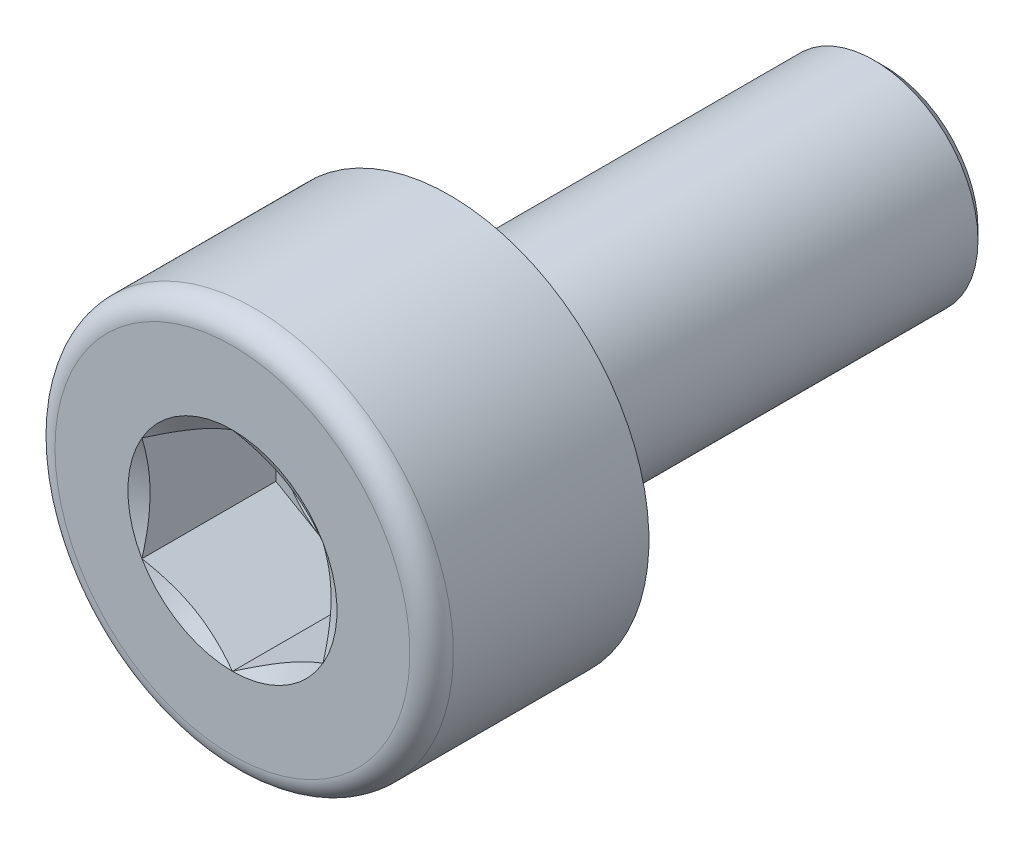
ISO-10303-21;
HEADER;
FILE_DESCRIPTION(('STEP AP214'),'2;1');
FILE_NAME('part.step','',(''),(''),'','','');
FILE_SCHEMA(('AUTOMOTIVE_DESIGN { 1 0 10303 214 1 1 1 1 }'));
ENDSEC;
DATA;
#1=APPLICATION_CONTEXT('core data for automotive mechanical design processes');
#2=APPLICATION_PROTOCOL_DEFINITION('international standard','automotive_design',2000,#1);
#3=PRODUCT_CONTEXT('',#1,'mechanical');
#4=PRODUCT('Part','Part','',(#3));
#5=PRODUCT_RELATED_PRODUCT_CATEGORY('part','',(#4));
#6=PRODUCT_DEFINITION_FORMATION('','',#4);
#7=PRODUCT_DEFINITION_CONTEXT('part definition',#1,'design');
#8=PRODUCT_DEFINITION('design','',#6,#7);
#9=PRODUCT_DEFINITION_SHAPE('','',#8);
#10=(LENGTH_UNIT() NAMED_UNIT(*) SI_UNIT(.MILLI.,.METRE.));
#11=(NAMED_UNIT(*) PLANE_ANGLE_UNIT() SI_UNIT($,.RADIAN.));
#12=(NAMED_UNIT(*) SI_UNIT($,.STERADIAN.) SOLID_ANGLE_UNIT());
#13=UNCERTAINTY_MEASURE_WITH_UNIT(LENGTH_MEASURE(1.E-05),#10,'distance_accuracy_value','');
#14=(GEOMETRIC_REPRESENTATION_CONTEXT(3) GLOBAL_UNCERTAINTY_ASSIGNED_CONTEXT((#13)) GLOBAL_UNIT_ASSIGNED_CONTEXT((#10,
#11,#12)) REPRESENTATION_CONTEXT('',''));
#15=CARTESIAN_POINT('',(0.,0.,0.));
#16=DIRECTION('',(0.,0.,1.));
#17=DIRECTION('',(1.,0.,0.));
#18=AXIS2_PLACEMENT_3D('',#15,#16,#17);
#19=CARTESIAN_POINT('',(0.,0.,-6.));
#20=DIRECTION('',(0.,0.,1.));
#21=DIRECTION('',(1.,0.,0.));
#22=AXIS2_PLACEMENT_3D('',#19,#20,#21);
#23=CONICAL_SURFACE('',#22,1.2933,0.7853981625);
#24=CARTESIAN_POINT('',(0.,0.,-6.));
#25=DIRECTION('',(0.,0.,-1.));
#26=DIRECTION('',(1.,0.,0.));
#27=AXIS2_PLACEMENT_3D('',#24,#25,#26);
#28=CIRCLE('',#27,1.2933);
#29=CARTESIAN_POINT('',(1.2933,0.,-6.));
#30=VERTEX_POINT('',#29);
#31=EDGE_CURVE('E381',#30,#30,#28,.T.);
#32=ORIENTED_EDGE('',*,*,#31,.F.);
#33=EDGE_LOOP('',(#32));
#34=FACE_BOUND('',#33,.T.);
#35=CARTESIAN_POINT('',(0.,0.,-5.8563));
#36=DIRECTION('',(0.,0.,1.));
#37=DIRECTION('',(1.,0.,0.));
#38=AXIS2_PLACEMENT_3D('',#35,#36,#37);
#39=CIRCLE('',#38,1.437);
#40=CARTESIAN_POINT('',(1.437,0.,-5.8563));
#41=VERTEX_POINT('',#40);
#42=EDGE_CURVE('E392',#41,#41,#39,.T.);
#43=ORIENTED_EDGE('',*,*,#42,.F.);
#44=EDGE_LOOP('',(#43));
#45=FACE_BOUND('',#44,.T.);
#46=ADVANCED_FACE('F16',(#34,#45),#23,.T.);
#47=CARTESIAN_POINT('',(0.,0.,-0.100000000000002));
#48=DIRECTION('',(0.,0.,1.));
#49=DIRECTION('',(1.,0.,0.));
#50=AXIS2_PLACEMENT_3D('',#47,#48,#49);
#51=TOROIDAL_SURFACE('',#50,1.537,0.1);
#52=CARTESIAN_POINT('',(0.,0.,-0.100000000000002));
#53=DIRECTION('',(0.,0.,-1.));
#54=DIRECTION('',(1.,0.,0.));
#55=AXIS2_PLACEMENT_3D('',#52,#53,#54);
#56=CIRCLE('',#55,1.437);
#57=CARTESIAN_POINT('',(1.437,0.,-0.100000000000002));
#58=VERTEX_POINT('',#57);
#59=EDGE_CURVE('E395',#58,#58,#56,.T.);
#60=ORIENTED_EDGE('',*,*,#59,.F.);
#61=EDGE_LOOP('',(#60));
#62=FACE_BOUND('',#61,.T.);
#63=CARTESIAN_POINT('',(0.,0.,0.));
#64=DIRECTION('',(0.,0.,1.));
#65=DIRECTION('',(1.,0.,0.));
#66=AXIS2_PLACEMENT_3D('',#63,#64,#65);
#67=CIRCLE('',#66,1.537);
#68=CARTESIAN_POINT('',(1.537,0.,0.));
#69=VERTEX_POINT('',#68);
#70=EDGE_CURVE('E292',#69,#69,#67,.T.);
#71=ORIENTED_EDGE('',*,*,#70,.F.);
#72=EDGE_LOOP('',(#71));
#73=FACE_BOUND('',#72,.T.);
#74=ADVANCED_FACE('F18',(#62,#73),#51,.F.);
#75=CARTESIAN_POINT('',(0.,0.,2.7));
#76=DIRECTION('',(0.,0.,-1.));
#77=DIRECTION('',(-1.,0.,0.));
#78=AXIS2_PLACEMENT_3D('',#75,#76,#77);
#79=TOROIDAL_SURFACE('',#78,2.45,0.3);
#80=CARTESIAN_POINT('',(0.,0.,2.7));
#81=DIRECTION('',(0.,0.,-1.));
#82=DIRECTION('',(-1.,0.,0.));
#83=AXIS2_PLACEMENT_3D('',#80,#81,#82);
#84=CIRCLE('',#83,2.75);
#85=CARTESIAN_POINT('',(-2.75,0.,2.7));
#86=VERTEX_POINT('',#85);
#87=EDGE_CURVE('E365',#86,#86,#84,.T.);
#88=ORIENTED_EDGE('',*,*,#87,.F.);
#89=EDGE_LOOP('',(#88));
#90=FACE_BOUND('',#89,.T.);
#91=CARTESIAN_POINT('',(0.,0.,3.));
#92=DIRECTION('',(0.,0.,1.));
#93=DIRECTION('',(-1.,0.,0.));
#94=AXIS2_PLACEMENT_3D('',#91,#92,#93);
#95=CIRCLE('',#94,2.45);
#96=CARTESIAN_POINT('',(-2.45,0.,3.));
#97=VERTEX_POINT('',#96);
#98=EDGE_CURVE('E367',#97,#97,#95,.T.);
#99=ORIENTED_EDGE('',*,*,#98,.F.);
#100=EDGE_LOOP('',(#99));
#101=FACE_BOUND('',#100,.T.);
#102=ADVANCED_FACE('F349',(#90,#101),#79,.T.);
#103=CARTESIAN_POINT('',(0.,0.,1.42831216351296));
#104=DIRECTION('',(0.,0.,1.));
#105=DIRECTION('',(1.,0.,0.));
#106=AXIS2_PLACEMENT_3D('',#103,#104,#105);
#107=CONICAL_SURFACE('',#106,1.73205080278248,1.04719755);
#108=CARTESIAN_POINT('',(0.,0.,0.428312163512963));
#109=VERTEX_POINT('',#108);
#110=VERTEX_LOOP('',#109);
#111=FACE_BOUND('',#110,.T.);
#112=CARTESIAN_POINT('',(0.,0.,1.15));
#113=DIRECTION('',(0.,0.,-1.));
#114=DIRECTION('',(-1.,0.,0.));
#115=AXIS2_PLACEMENT_3D('',#112,#113,#114);
#116=CIRCLE('',#115,1.25);
#117=CARTESIAN_POINT('',(-1.25,0.,1.15));
#118=VERTEX_POINT('',#117);
#119=CARTESIAN_POINT('',(-0.625,1.08253175473055,1.15));
#120=VERTEX_POINT('',#119);
#121=EDGE_CURVE('E154',#118,#120,#116,.T.);
#122=ORIENTED_EDGE('',*,*,#121,.F.);
#123=CARTESIAN_POINT('',(0.,0.,1.15));
#124=DIRECTION('',(0.,0.,1.));
#125=DIRECTION('',(1.,0.,0.));
#126=AXIS2_PLACEMENT_3D('',#123,#124,#125);
#127=CIRCLE('',#126,1.25);
#128=CARTESIAN_POINT('',(-0.625,-1.08253175473055,1.15));
#129=VERTEX_POINT('',#128);
#130=EDGE_CURVE('E427',#118,#129,#127,.T.);
#131=ORIENTED_EDGE('',*,*,#130,.T.);
#132=CARTESIAN_POINT('',(0.,0.,1.15));
#133=DIRECTION('',(0.,0.,1.));
#134=DIRECTION('',(1.,0.,0.));
#135=AXIS2_PLACEMENT_3D('',#132,#133,#134);
#136=CIRCLE('',#135,1.25);
#137=CARTESIAN_POINT('',(0.625,-1.08253175473055,1.15));
#138=VERTEX_POINT('',#137);
#139=EDGE_CURVE('E415',#129,#138,#136,.T.);
#140=ORIENTED_EDGE('',*,*,#139,.T.);
#141=CARTESIAN_POINT('',(0.,0.,1.15));
#142=DIRECTION('',(0.,0.,1.));
#143=DIRECTION('',(1.,0.,0.));
#144=AXIS2_PLACEMENT_3D('',#141,#142,#143);
#145=CIRCLE('',#144,1.25);
#146=CARTESIAN_POINT('',(1.25,0.,1.15));
#147=VERTEX_POINT('',#146);
#148=EDGE_CURVE('E386',#138,#147,#145,.T.);
#149=ORIENTED_EDGE('',*,*,#148,.T.);
#150=CARTESIAN_POINT('',(0.,0.,1.15));
#151=DIRECTION('',(0.,0.,1.));
#152=DIRECTION('',(1.,0.,0.));
#153=AXIS2_PLACEMENT_3D('',#150,#151,#152);
#154=CIRCLE('',#153,1.25);
#155=CARTESIAN_POINT('',(0.625,1.08253175473055,1.15));
#156=VERTEX_POINT('',#155);
#157=EDGE_CURVE('E158',#147,#156,#154,.T.);
#158=ORIENTED_EDGE('',*,*,#157,.T.);
#159=CARTESIAN_POINT('',(0.,0.,1.15));
#160=DIRECTION('',(0.,0.,1.));
#161=DIRECTION('',(1.,0.,0.));
#162=AXIS2_PLACEMENT_3D('',#159,#160,#161);
#163=CIRCLE('',#162,1.25);
#164=EDGE_CURVE('E141',#156,#120,#163,.T.);
#165=ORIENTED_EDGE('',*,*,#164,.T.);
#166=EDGE_LOOP('',(#122,#131,#140,#149,#158,#165));
#167=FACE_BOUND('',#166,.T.);
#168=ADVANCED_FACE('F151',(#111,#167),#107,.F.);
#169=CARTESIAN_POINT('',(1.25,0.721687836487035,3.));
#170=DIRECTION('',(-0.5,-0.866025403784441,0.));
#171=DIRECTION('',(-0.866025403784441,0.5,0.));
#172=AXIS2_PLACEMENT_3D('',#169,#170,#171);
#173=PLANE('',#172);
#174=DIRECTION('',(-0.866025403784441,0.5,0.));
#175=VECTOR('',#174,1.);
#176=CARTESIAN_POINT('',(1.25,0.721687836487035,1.15));
#177=LINE('',#176,#175);
#178=CARTESIAN_POINT('',(0.,1.44337567297406,1.15));
#179=VERTEX_POINT('',#178);
#180=EDGE_CURVE('E143',#156,#179,#177,.T.);
#181=ORIENTED_EDGE('',*,*,#180,.F.);
#182=DIRECTION('',(-0.866025403784441,0.5,0.));
#183=VECTOR('',#182,1.);
#184=CARTESIAN_POINT('',(1.25,0.721687836487035,1.15));
#185=LINE('',#184,#183);
#186=CARTESIAN_POINT('',(1.25,0.721687836487035,1.15));
#187=VERTEX_POINT('',#186);
#188=EDGE_CURVE('E406',#187,#156,#185,.T.);
#189=ORIENTED_EDGE('',*,*,#188,.F.);
#190=DIRECTION('',(0.,0.,-1.));
#191=VECTOR('',#190,1.);
#192=CARTESIAN_POINT('',(1.25,0.721687836487035,3.));
#193=LINE('',#192,#191);
#194=CARTESIAN_POINT('',(1.25,0.721687836487024,3.));
#195=VERTEX_POINT('',#194);
#196=EDGE_CURVE('E244',#195,#187,#193,.T.);
#197=ORIENTED_EDGE('',*,*,#196,.F.);
#198=CARTESIAN_POINT('',(0.,1.44337567284047,3.00000000023139));
#199=CARTESIAN_POINT('',(0.0261486626377277,1.42827645855927,2.99128306043439));
#200=CARTESIAN_POINT('',(0.0524002600754049,1.41312937725243,2.98294748844822));
#201=CARTESIAN_POINT('',(0.104495873425316,1.38308934658892,2.96732278339727));
#202=CARTESIAN_POINT('',(0.130335265325067,1.36819862659326,2.96001390009703));
#203=CARTESIAN_POINT('',(0.181729341352907,1.33859568366657,2.94643942195175));
#204=CARTESIAN_POINT('',(0.207280592333919,1.32388517541775,2.94015719440903));
#205=CARTESIAN_POINT('',(0.258232252657802,1.29455199540426,2.92863647198877));
#206=CARTESIAN_POINT('',(0.283630625111301,1.27993048405865,2.92338604030578));
#207=CARTESIAN_POINT('',(0.335639778180528,1.24991494541684,2.91367734656316));
#208=CARTESIAN_POINT('',(0.362255394791844,1.23451490297741,2.90926328258994));
#209=CARTESIAN_POINT('',(0.415084922042939,1.20392839151166,2.90171043433189));
#210=CARTESIAN_POINT('',(0.441296474931499,1.18874365649872,2.89854833905419));
#211=CARTESIAN_POINT('',(0.493589851795029,1.15848550046678,2.89349413621187));
#212=CARTESIAN_POINT('',(0.519670718979129,1.14341230816098,2.89159085057907));
#213=CARTESIAN_POINT('',(0.571952421904962,1.11321018942334,2.88903722033789));
#214=CARTESIAN_POINT('',(0.598153393077263,1.09808122023655,2.88839016057665));
#215=CARTESIAN_POINT('',(0.650542956658561,1.06778492970108,2.88834410495955));
#216=CARTESIAN_POINT('',(0.676731544502693,1.05261759991423,2.88894541290268));
#217=CARTESIAN_POINT('',(0.729032617876563,1.02237300521761,2.89142614711666));
#218=CARTESIAN_POINT('',(0.75514515257742,1.0072956227839,2.89330309641229));
#219=CARTESIAN_POINT('',(0.807563231939904,0.977081421621639,2.89831800651403));
#220=CARTESIAN_POINT('',(0.833868102892131,0.961945510791896,2.90146836202563));
#221=CARTESIAN_POINT('',(0.886901508360168,0.931420836302444,2.90901129441772));
#222=CARTESIAN_POINT('',(0.913627289183246,0.916033465876731,2.91342865015837));
#223=CARTESIAN_POINT('',(0.965746150903101,0.885954347165538,2.92314595643109));
#224=CARTESIAN_POINT('',(0.991147076462341,0.871261167923065,2.92839972832637));
#225=CARTESIAN_POINT('',(1.0421308351261,0.84177602119279,2.93993798430538));
#226=CARTESIAN_POINT('',(1.0677115073665,0.826985390385257,2.94623540306553));
#227=CARTESIAN_POINT('',(1.1192018265591,0.797225209642964,2.95985026422617));
#228=CARTESIAN_POINT('',(1.1451080550624,0.78225785823175,2.96718532482893));
#229=CARTESIAN_POINT('',(1.19737805108056,0.752068010380933,2.98287274671504));
#230=CARTESIAN_POINT('',(1.22373727391991,0.736848367293889,2.99124579267558));
#231=CARTESIAN_POINT('',(1.2499999998843,0.721687836420227,3.00000000023139));
#232=B_SPLINE_CURVE_WITH_KNOTS('',3,(#198,#199,#200,#201,#202,#203,#204,#205,#206,#207,#208,
#209,#210,#211,#212,#213,#214,#215,#216,#217,#218,#219,#220,#221,#222,#223,#224,#225,#226,#227,
#228,#229,#230,#231),.UNSPECIFIED.,.F.,.F.,(4,2,2,2,2,2,2,2,2,2,2,2,2,2,2,2,4),(0.,
0.0942858935276673,0.186390154067362,0.276810308466974,0.366113276527631,0.459286869862154,
0.550633312481888,0.641157312678764,0.731917702782899,0.822700182650743,0.913306887476018,
1.004817606954,1.09825677403963,1.18767366357428,1.2782954242335,1.37069864305907,
1.46538879471708),.UNSPECIFIED.);
#233=CARTESIAN_POINT('',(0.,1.44337567297406,3.));
#234=VERTEX_POINT('',#233);
#235=EDGE_CURVE('E189',#234,#195,#232,.T.);
#236=ORIENTED_EDGE('',*,*,#235,.F.);
#237=DIRECTION('',(0.,0.,-1.));
#238=VECTOR('',#237,1.);
#239=CARTESIAN_POINT('',(0.,1.44337567297406,3.));
#240=LINE('',#239,#238);
#241=EDGE_CURVE('E11',#234,#179,#240,.T.);
#242=ORIENTED_EDGE('',*,*,#241,.T.);
#243=EDGE_LOOP('',(#181,#189,#197,#236,#242));
#244=FACE_BOUND('',#243,.T.);
#245=ADVANCED_FACE('F361',(#244),#173,.T.);
#246=CARTESIAN_POINT('',(0.,1.44337567297406,3.));
#247=DIRECTION('',(0.5,-0.866025403784439,0.));
#248=DIRECTION('',(0.,0.,-1.));
#249=AXIS2_PLACEMENT_3D('',#246,#247,#248);
#250=PLANE('',#249);
#251=DIRECTION('',(-0.866025403784439,-0.5,0.));
#252=VECTOR('',#251,1.);
#253=CARTESIAN_POINT('',(0.,1.44337567297406,1.15));
#254=LINE('',#253,#252);
#255=CARTESIAN_POINT('',(-1.25,0.721687836487028,1.15));
#256=VERTEX_POINT('',#255);
#257=EDGE_CURVE('E163',#120,#256,#254,.T.);
#258=ORIENTED_EDGE('',*,*,#257,.F.);
#259=DIRECTION('',(-0.866025403784439,-0.5,0.));
#260=VECTOR('',#259,1.);
#261=CARTESIAN_POINT('',(0.,1.44337567297406,1.15));
#262=LINE('',#261,#260);
#263=EDGE_CURVE('E29',#179,#120,#262,.T.);
#264=ORIENTED_EDGE('',*,*,#263,.F.);
#265=ORIENTED_EDGE('',*,*,#241,.F.);
#266=CARTESIAN_POINT('',(-1.2499999998843,0.721687836420233,3.00000000023139));
#267=CARTESIAN_POINT('',(-1.22384936542129,0.736783635398587,2.99128306043458));
#268=CARTESIAN_POINT('',(-1.19760580949811,0.751944645015849,2.9829474884486));
#269=CARTESIAN_POINT('',(-1.14554257313888,0.782040754270563,2.9673227833979));
#270=CARTESIAN_POINT('',(-1.11972713539232,0.796972964076239,2.96001390009773));
#271=CARTESIAN_POINT('',(-1.06839319677714,0.826680068057156,2.94643942195245));
#272=CARTESIAN_POINT('',(-1.04287789744039,0.841452846380916,2.94015719440968));
#273=CARTESIAN_POINT('',(-0.991998788212219,0.870911688579953,2.92863647198916));
#274=CARTESIAN_POINT('',(-0.96663700171786,0.885596568666817,2.92338604030597));
#275=CARTESIAN_POINT('',(-0.914638206210908,0.915630047132929,2.91367734656314));
#276=CARTESIAN_POINT('',(-0.887993569933689,0.930979826035593,2.90926328258988));
#277=CARTESIAN_POINT('',(-0.835090110366166,0.961438282971625,2.90171043433179));
#278=CARTESIAN_POINT('',(-0.808833967651103,0.976545786139225,2.89854833905409));
#279=CARTESIAN_POINT('',(-0.756482947424055,1.00670410093683,2.89349413621178));
#280=CARTESIAN_POINT('',(-0.73038874637895,1.02175419831824,2.891590850579));
#281=CARTESIAN_POINT('',(-0.67809209284063,1.05193042183679,2.88903722033784));
#282=CARTESIAN_POINT('',(-0.651889535605254,1.06705664388276,2.88839016057663));
#283=CARTESIAN_POINT('',(-0.599457396569536,1.09727919157022,2.88834410495957));
#284=CARTESIAN_POINT('',(-0.573227809743954,1.11237550903933,2.88894541290272));
#285=CARTESIAN_POINT('',(-0.52088468572185,1.14254726987831,2.89142614711672));
#286=CARTESIAN_POINT('',(-0.494771022161039,1.15762269706963,2.89330309641235));
#287=CARTESIAN_POINT('',(-0.442395716718162,1.1879109848339,2.89831800651409));
#288=CARTESIAN_POINT('',(-0.416135197954219,1.20312371590679,2.90146836202567));
#289=CARTESIAN_POINT('',(-0.363183351670814,1.23378965504624,2.90901129441774));
#290=CARTESIAN_POINT('',(-0.33649460757375,1.24924117496195,2.9134286501584));
#291=CARTESIAN_POINT('',(-0.284385895786728,1.27933787387223,2.92314595643123));
#292=CARTESIAN_POINT('',(-0.258960766520434,1.29398913106527,2.92839972832667));
#293=CARTESIAN_POINT('',(-0.207934001085328,1.32339978788377,2.93993798430589));
#294=CARTESIAN_POINT('',(-0.182334602947639,1.33815798448614,2.94623540306607));
#295=CARTESIAN_POINT('',(-0.130816370807225,1.36786981858468,2.95985026422671));
#296=CARTESIAN_POINT('',(-0.104901150006188,1.38282159487905,2.96718532482942));
#297=CARTESIAN_POINT('',(-0.0526209768224105,1.41299381536067,2.98287274671533));
#298=CARTESIAN_POINT('',(-0.02626076785323,1.42821175041975,2.99124579267573));
#299=CARTESIAN_POINT('',(0.,1.44337567284047,3.00000000023139));
#300=B_SPLINE_CURVE_WITH_KNOTS('',3,(#266,#267,#268,#269,#270,#271,#272,#273,#274,#275,#276,
#277,#278,#279,#280,#281,#282,#283,#284,#285,#286,#287,#288,#289,#290,#291,#292,#293,#294,#295,
#296,#297,#298,#299),.UNSPECIFIED.,.F.,.F.,(4,2,2,2,2,2,2,2,2,2,2,2,2,2,2,2,4),(0.,
0.0942858935256879,0.186390154064789,0.276810308465094,0.366113276527611,0.459286869860659,
0.55063331247989,0.641157312677259,0.731917702782905,0.822700182652538,0.913306887478418,
1.00481760695581,1.09825677403965,1.18767366357574,1.27829542423549,1.3706986430606,
1.46538879471708),.UNSPECIFIED.);
#301=CARTESIAN_POINT('',(-1.25,0.721687836487028,3.));
#302=VERTEX_POINT('',#301);
#303=EDGE_CURVE('E467',#302,#234,#300,.T.);
#304=ORIENTED_EDGE('',*,*,#303,.F.);
#305=DIRECTION('',(0.,0.,-1.));
#306=VECTOR('',#305,1.);
#307=CARTESIAN_POINT('',(-1.25,0.721687836487028,3.));
#308=LINE('',#307,#306);
#309=EDGE_CURVE('E160',#302,#256,#308,.T.);
#310=ORIENTED_EDGE('',*,*,#309,.T.);
#311=EDGE_LOOP('',(#258,#264,#265,#304,#310));
#312=FACE_BOUND('',#311,.T.);
#313=ADVANCED_FACE('F164',(#312),#250,.T.);
#314=CARTESIAN_POINT('',(-1.25,2.16506350946108,1.15));
#315=DIRECTION('',(0.,0.,1.));
#316=DIRECTION('',(1.,0.,0.));
#317=AXIS2_PLACEMENT_3D('',#314,#315,#316);
#318=PLANE('',#317);
#319=ORIENTED_EDGE('',*,*,#164,.F.);
#320=ORIENTED_EDGE('',*,*,#180,.T.);
#321=ORIENTED_EDGE('',*,*,#263,.T.);
#322=EDGE_LOOP('',(#319,#320,#321));
#323=FACE_BOUND('',#322,.T.);
#324=ADVANCED_FACE('F140',(#323),#318,.T.);
#325=CARTESIAN_POINT('',(-1.25,0.721687836487028,3.));
#326=DIRECTION('',(1.,0.,0.));
#327=DIRECTION('',(0.,1.,0.));
#328=AXIS2_PLACEMENT_3D('',#325,#326,#327);
#329=PLANE('',#328);
#330=DIRECTION('',(0.,-1.,0.));
#331=VECTOR('',#330,1.);
#332=CARTESIAN_POINT('',(-1.25,0.721687836487028,1.15));
#333=LINE('',#332,#331);
#334=CARTESIAN_POINT('',(-1.25,-0.721687836487037,1.15));
#335=VERTEX_POINT('',#334);
#336=EDGE_CURVE('E429',#118,#335,#333,.T.);
#337=ORIENTED_EDGE('',*,*,#336,.F.);
#338=DIRECTION('',(0.,-1.,0.));
#339=VECTOR('',#338,1.);
#340=CARTESIAN_POINT('',(-1.25,0.721687836487028,1.15));
#341=LINE('',#340,#339);
#342=EDGE_CURVE('E169',#256,#118,#341,.T.);
#343=ORIENTED_EDGE('',*,*,#342,.F.);
#344=ORIENTED_EDGE('',*,*,#309,.F.);
#345=CARTESIAN_POINT('',(-1.24999999988429,-0.72168783642025,3.00000000023139));
#346=CARTESIAN_POINT('',(-1.2500004147281,-0.690128070702244,2.99089147848129));
#347=CARTESIAN_POINT('',(-1.24993959648864,-0.658453994502855,2.98216393562933));
#348=CARTESIAN_POINT('',(-1.24976856559694,-0.595951101805759,2.96590077500604));
#349=CARTESIAN_POINT('',(-1.24966010320642,-0.565130175056005,2.95833471472052));
#350=CARTESIAN_POINT('',(-1.24946045425039,-0.504155850605307,2.94439079914096));
#351=CARTESIAN_POINT('',(-1.24936885886421,-0.474008917255145,2.93798491454303));
#352=CARTESIAN_POINT('',(-1.24924979768652,-0.414183840755463,2.9263591046628));
#353=CARTESIAN_POINT('',(-1.24922094635624,-0.384510249921787,2.92111590310414));
#354=CARTESIAN_POINT('',(-1.24924740792717,-0.325410524416997,2.91180975820521));
#355=CARTESIAN_POINT('',(-1.24930152811669,-0.295986883564501,2.90773107040718));
#356=CARTESIAN_POINT('',(-1.24948016507871,-0.237145991042515,2.9007452606939));
#357=CARTESIAN_POINT('',(-1.24960433725962,-0.20772940797973,2.89783252237994));
#358=CARTESIAN_POINT('',(-1.24987262870238,-0.148644644941409,2.89316875963925));
#359=CARTESIAN_POINT('',(-1.25001685196824,-0.118975963813244,2.89142408767128));
#360=CARTESIAN_POINT('',(-1.25022150900378,-0.0591169703210918,2.88907990210777));
#361=CARTESIAN_POINT('',(-1.2502805614536,-0.0289259253187226,2.88849920885396));
#362=CARTESIAN_POINT('',(-1.25019774154466,0.0312110658704783,2.88848654167406));
#363=CARTESIAN_POINT('',(-1.25005749729482,0.0611570110264564,2.88904527562548));
#364=CARTESIAN_POINT('',(-1.24974154590929,0.12056217488515,2.89135600417819));
#365=CARTESIAN_POINT('',(-1.24956639077492,0.150022073550911,2.89309032514706));
#366=CARTESIAN_POINT('',(-1.24926328253542,0.208727715352198,2.89773527623382));
#367=CARTESIAN_POINT('',(-1.24913513915046,0.237973841485386,2.90064106224174));
#368=CARTESIAN_POINT('',(-1.2489700912517,0.296514085332114,2.90761679480265));
#369=CARTESIAN_POINT('',(-1.24893376860764,0.325807337770213,2.91169398426425));
#370=CARTESIAN_POINT('',(-1.2489545832448,0.384688254896478,2.92100032375456));
#371=CARTESIAN_POINT('',(-1.24901322092899,0.41427315995873,2.92624681545434));
#372=CARTESIAN_POINT('',(-1.24919513149082,0.473964412154938,2.93788266129138));
#373=CARTESIAN_POINT('',(-1.2493199441243,0.504065905074943,2.94429674279473));
#374=CARTESIAN_POINT('',(-1.24958034795018,0.564994362965716,2.95826057479285));
#375=CARTESIAN_POINT('',(-1.24971615417792,0.595814566884945,2.96583957409321));
#376=CARTESIAN_POINT('',(-1.24992757883415,0.658362190949224,2.98213275857176));
#377=CARTESIAN_POINT('',(-1.25000080891054,0.690081461189497,2.99087836845364));
#378=CARTESIAN_POINT('',(-1.2499999998843,0.721687836420233,3.00000000023139));
#379=B_SPLINE_CURVE_WITH_KNOTS('',3,(#345,#346,#347,#348,#349,#350,#351,#352,#353,#354,#355,
#356,#357,#358,#359,#360,#361,#362,#363,#364,#365,#366,#367,#368,#369,#370,#371,#372,#373,#374,
#375,#376,#377,#378),.UNSPECIFIED.,.F.,.F.,(4,2,2,2,2,2,2,2,2,2,2,2,2,2,2,2,4),(0.,
0.0985474022567773,0.193743188034329,0.286186620084187,0.376567026628268,0.465660347401602,
0.554319184923905,0.643456354270609,0.734023516052054,0.823855049162585,0.912365170288753,
1.00051298810286,1.08921801568405,1.17933833526412,1.27165404226876,1.36685749309166,
1.46555021996934),.UNSPECIFIED.);
#380=CARTESIAN_POINT('',(-1.25,-0.721687836487044,3.));
#381=VERTEX_POINT('',#380);
#382=EDGE_CURVE('E533',#381,#302,#379,.T.);
#383=ORIENTED_EDGE('',*,*,#382,.F.);
#384=DIRECTION('',(0.,0.,-1.));
#385=VECTOR('',#384,1.);
#386=CARTESIAN_POINT('',(-1.25,-0.721687836487037,3.));
#387=LINE('',#386,#385);
#388=EDGE_CURVE('E173',#381,#335,#387,.T.);
#389=ORIENTED_EDGE('',*,*,#388,.T.);
#390=EDGE_LOOP('',(#337,#343,#344,#383,#389));
#391=FACE_BOUND('',#390,.T.);
#392=ADVANCED_FACE('F270',(#391),#329,.T.);
#393=CARTESIAN_POINT('',(-1.25,2.16506350946108,1.15));
#394=DIRECTION('',(0.,0.,1.));
#395=DIRECTION('',(1.,0.,0.));
#396=AXIS2_PLACEMENT_3D('',#393,#394,#395);
#397=PLANE('',#396);
#398=ORIENTED_EDGE('',*,*,#121,.T.);
#399=ORIENTED_EDGE('',*,*,#257,.T.);
#400=ORIENTED_EDGE('',*,*,#342,.T.);
#401=EDGE_LOOP('',(#398,#399,#400));
#402=FACE_BOUND('',#401,.T.);
#403=ADVANCED_FACE('F171',(#402),#397,.T.);
#404=CARTESIAN_POINT('',(-1.25,-0.721687836487037,3.));
#405=DIRECTION('',(0.5,0.866025403784441,0.));
#406=DIRECTION('',(0.,0.,-1.));
#407=AXIS2_PLACEMENT_3D('',#404,#405,#406);
#408=PLANE('',#407);
#409=DIRECTION('',(0.866025403784441,-0.5,0.));
#410=VECTOR('',#409,1.);
#411=CARTESIAN_POINT('',(-1.25,-0.721687836487037,1.15));
#412=LINE('',#411,#410);
#413=CARTESIAN_POINT('',(0.,-1.44337567297406,1.15));
#414=VERTEX_POINT('',#413);
#415=EDGE_CURVE('E419',#129,#414,#412,.T.);
#416=ORIENTED_EDGE('',*,*,#415,.F.);
#417=DIRECTION('',(0.866025403784441,-0.5,0.));
#418=VECTOR('',#417,1.);
#419=CARTESIAN_POINT('',(-1.25,-0.721687836487037,1.15));
#420=LINE('',#419,#418);
#421=EDGE_CURVE('E178',#335,#129,#420,.T.);
#422=ORIENTED_EDGE('',*,*,#421,.F.);
#423=ORIENTED_EDGE('',*,*,#388,.F.);
#424=CARTESIAN_POINT('',(0.,-1.44337567284047,3.00000000023139));
#425=CARTESIAN_POINT('',(-0.0261486626382417,-1.42827645855896,2.99128306043422));
#426=CARTESIAN_POINT('',(-0.0524002600764165,-1.41312937725177,2.98294748844786));
#427=CARTESIAN_POINT('',(-0.104495873426942,-1.38308934658776,2.96732278339666));
#428=CARTESIAN_POINT('',(-0.130335265326808,-1.36819862659194,2.96001390009636));
#429=CARTESIAN_POINT('',(-0.18172934135456,-1.33859568366516,2.94643942195107));
#430=CARTESIAN_POINT('',(-0.207280592335365,-1.32388517541641,2.94015719440839));
#431=CARTESIAN_POINT('',(-0.25823225265863,-1.29455199540342,2.9286364719884));
#432=CARTESIAN_POINT('',(-0.283630625111714,-1.27993048405824,2.92338604030561));
#433=CARTESIAN_POINT('',(-0.335639778181223,-1.24991494541663,2.91367734656313));
#434=CARTESIAN_POINT('',(-0.362255394793239,-1.23451490297697,2.90926328258991));
#435=CARTESIAN_POINT('',(-0.415084922045207,-1.20392839151083,2.90171043433186));
#436=CARTESIAN_POINT('',(-0.44129647493394,-1.18874365649772,2.89854833905413));
#437=CARTESIAN_POINT('',(-0.493589851797389,-1.15848550046565,2.8934941362118));
#438=CARTESIAN_POINT('',(-0.519670718981233,-1.14341230815989,2.89159085057901));
#439=CARTESIAN_POINT('',(-0.571952421906184,-1.11321018942263,2.88903722033786));
#440=CARTESIAN_POINT('',(-0.598153393077858,-1.09808122023618,2.88839016057664));
#441=CARTESIAN_POINT('',(-0.650542956658405,-1.0677849297012,2.88834410495957));
#442=CARTESIAN_POINT('',(-0.676731544502412,-1.0526175999145,2.88894541290273));
#443=CARTESIAN_POINT('',(-0.729032617876124,-1.02237300521809,2.89142614711674));
#444=CARTESIAN_POINT('',(-0.755145152576947,-1.00729562278443,2.89330309641238));
#445=CARTESIAN_POINT('',(-0.807563231939451,-0.977081421622204,2.89831800651412));
#446=CARTESIAN_POINT('',(-0.833868102891733,-0.961945510792434,2.90146836202571));
#447=CARTESIAN_POINT('',(-0.886901508359935,-0.931420836302788,2.90901129441776));
#448=CARTESIAN_POINT('',(-0.913627289183122,-0.916033465876906,2.91342865015839));
#449=CARTESIAN_POINT('',(-0.965746150902798,-0.885954347165624,2.923145956431));
#450=CARTESIAN_POINT('',(-0.991147076461753,-0.871261167923229,2.92839972832618));
#451=CARTESIAN_POINT('',(-1.04213083512514,-0.841776021193103,2.93993798430506));
#452=CARTESIAN_POINT('',(-1.06771150736546,-0.826985390385641,2.94623540306519));
#453=CARTESIAN_POINT('',(-1.11920182655807,-0.797225209643409,2.95985026422583));
#454=CARTESIAN_POINT('',(-1.14510805506147,-0.782257858232186,2.96718532482863));
#455=CARTESIAN_POINT('',(-1.19737805108001,-0.752068010381233,2.98287274671486));
#456=CARTESIAN_POINT('',(-1.22373727391963,-0.736848367294062,2.9912457926755));
#457=CARTESIAN_POINT('',(-1.24999999988429,-0.72168783642025,3.00000000023139));
#458=B_SPLINE_CURVE_WITH_KNOTS('',3,(#424,#425,#426,#427,#428,#429,#430,#431,#432,#433,#434,
#435,#436,#437,#438,#439,#440,#441,#442,#443,#444,#445,#446,#447,#448,#449,#450,#451,#452,#453,
#454,#455,#456,#457),.UNSPECIFIED.,.F.,.F.,(4,2,2,2,2,2,2,2,2,2,2,2,2,2,2,2,4),(0.,
0.0942858935295678,0.186390154069829,0.276810308468775,0.366113276527643,0.459286869864305,
0.550633312484744,0.641157312680898,0.731917702782893,0.822700182650189,0.913306887475293,
1.00481760695346,1.09825677403961,1.18767366357336,1.27829542423224,1.37069864305809,
1.46538879471706),.UNSPECIFIED.);
#459=CARTESIAN_POINT('',(0.,-1.44337567297406,3.));
#460=VERTEX_POINT('',#459);
#461=EDGE_CURVE('E301',#460,#381,#458,.T.);
#462=ORIENTED_EDGE('',*,*,#461,.F.);
#463=DIRECTION('',(0.,0.,-1.));
#464=VECTOR('',#463,1.);
#465=CARTESIAN_POINT('',(0.,-1.44337567297406,3.));
#466=LINE('',#465,#464);
#467=EDGE_CURVE('E425',#460,#414,#466,.T.);
#468=ORIENTED_EDGE('',*,*,#467,.T.);
#469=EDGE_LOOP('',(#416,#422,#423,#462,#468));
#470=FACE_BOUND('',#469,.T.);
#471=ADVANCED_FACE('F441',(#470),#408,.T.);
#472=CARTESIAN_POINT('',(-1.25,2.16506350946108,1.15));
#473=DIRECTION('',(0.,0.,1.));
#474=DIRECTION('',(1.,0.,0.));
#475=AXIS2_PLACEMENT_3D('',#472,#473,#474);
#476=PLANE('',#475);
#477=ORIENTED_EDGE('',*,*,#130,.F.);
#478=ORIENTED_EDGE('',*,*,#336,.T.);
#479=ORIENTED_EDGE('',*,*,#421,.T.);
#480=EDGE_LOOP('',(#477,#478,#479));
#481=FACE_BOUND('',#480,.T.);
#482=ADVANCED_FACE('F226',(#481),#476,.T.);
#483=CARTESIAN_POINT('',(0.,-1.44337567297406,3.));
#484=DIRECTION('',(-0.5,0.866025403784438,0.));
#485=DIRECTION('',(0.,0.,1.));
#486=AXIS2_PLACEMENT_3D('',#483,#484,#485);
#487=PLANE('',#486);
#488=DIRECTION('',(0.866025403784438,0.5,0.));
#489=VECTOR('',#488,1.);
#490=CARTESIAN_POINT('',(0.,-1.44337567297406,1.15));
#491=LINE('',#490,#489);
#492=CARTESIAN_POINT('',(1.25,-0.72168783648703,1.15));
#493=VERTEX_POINT('',#492);
#494=EDGE_CURVE('E382',#138,#493,#491,.T.);
#495=ORIENTED_EDGE('',*,*,#494,.F.);
#496=DIRECTION('',(0.866025403784438,0.5,0.));
#497=VECTOR('',#496,1.);
#498=CARTESIAN_POINT('',(0.,-1.44337567297406,1.15));
#499=LINE('',#498,#497);
#500=EDGE_CURVE('E423',#414,#138,#499,.T.);
#501=ORIENTED_EDGE('',*,*,#500,.F.);
#502=ORIENTED_EDGE('',*,*,#467,.F.);
#503=CARTESIAN_POINT('',(1.2499999998843,-0.721687836420231,3.00000000023139));
#504=CARTESIAN_POINT('',(1.22384936542062,-0.736783635398966,2.99128306043436));
#505=CARTESIAN_POINT('',(1.19760580949674,-0.751944645016551,2.98294748844814));
#506=CARTESIAN_POINT('',(1.14554257313656,-0.782040754271615,2.96732278339713));
#507=CARTESIAN_POINT('',(1.11972713538976,-0.796972964077315,2.96001390009688));
#508=CARTESIAN_POINT('',(1.06839319677454,-0.82668006805808,2.9464394219516));
#509=CARTESIAN_POINT('',(1.04287789743801,-0.841452846381661,2.94015719440888));
#510=CARTESIAN_POINT('',(0.991998788210772,-0.87091168858033,2.92863647198869));
#511=CARTESIAN_POINT('',(0.966637001717135,-0.885596568667001,2.92338604030574));
#512=CARTESIAN_POINT('',(0.914638206210468,-0.915630047133424,2.91367734656316));
#513=CARTESIAN_POINT('',(0.887993569932804,-0.930979826036596,2.90926328258994));
#514=CARTESIAN_POINT('',(0.835090110364631,-0.96143828297321,2.9017104343319));
#515=CARTESIAN_POINT('',(0.808833967649366,-0.976545786140887,2.89854833905419));
#516=CARTESIAN_POINT('',(0.756482947422249,-1.00670410093838,2.89349413621187));
#517=CARTESIAN_POINT('',(0.730388746377277,-1.0217541983196,2.89159085057907));
#518=CARTESIAN_POINT('',(0.678092092839595,-1.05193042183755,2.88903722033789));
#519=CARTESIAN_POINT('',(0.651889535604725,-1.06705664388312,2.88839016057666));
#520=CARTESIAN_POINT('',(0.599457396569889,-1.09727919156997,2.88834410495955));
#521=CARTESIAN_POINT('',(0.573227809744683,-1.11237550903887,2.88894541290268));
#522=CARTESIAN_POINT('',(0.520884685723106,-1.14254726987761,2.89142614711666));
#523=CARTESIAN_POINT('',(0.494771022162447,-1.1576226970689,2.89330309641229));
#524=CARTESIAN_POINT('',(0.442395716719619,-1.18791098483324,2.89831800651403));
#525=CARTESIAN_POINT('',(0.416135197955574,-1.20312371590624,2.90146836202562));
#526=CARTESIAN_POINT('',(0.363183351671651,-1.23378965504595,2.90901129441771));
#527=CARTESIAN_POINT('',(0.336494607574171,-1.24924117496181,2.91342865015837));
#528=CARTESIAN_POINT('',(0.284385895786955,-1.27933787387201,2.92314595643114));
#529=CARTESIAN_POINT('',(0.258960766520879,-1.29398913106483,2.92839972832647));
#530=CARTESIAN_POINT('',(0.2079340010861,-1.32339978788306,2.93993798430555));
#531=CARTESIAN_POINT('',(0.182334602948522,-1.33815798448539,2.94623540306571));
#532=CARTESIAN_POINT('',(0.130816370808157,-1.36786981858398,2.95985026422636));
#533=CARTESIAN_POINT('',(0.10490115000706,-1.38282159487843,2.9671853248291));
#534=CARTESIAN_POINT('',(0.0526209768229601,-1.41299381536032,2.98287274671514));
#535=CARTESIAN_POINT('',(0.0262607678535172,-1.42821175041958,2.99124579267563));
#536=CARTESIAN_POINT('',(0.,-1.44337567284047,3.00000000023139));
#537=B_SPLINE_CURVE_WITH_KNOTS('',3,(#503,#504,#505,#506,#507,#508,#509,#510,#511,#512,#513,
#514,#515,#516,#517,#518,#519,#520,#521,#522,#523,#524,#525,#526,#527,#528,#529,#530,#531,#532,
#533,#534,#535,#536),.UNSPECIFIED.,.F.,.F.,(4,2,2,2,2,2,2,2,2,2,2,2,2,2,2,2,4),(0.,
0.0942858935280929,0.186390154067911,0.27681030846737,0.36611327652762,0.45928686986255,
0.550633312482422,0.641157312679164,0.731917702782893,0.822700182651235,0.913306887476676,
1.00481760695449,1.09825677403963,1.18767366357477,1.27829542423417,1.37069864305958,
1.46538879471706),.UNSPECIFIED.);
#538=CARTESIAN_POINT('',(1.25,-0.721687836487024,3.));
#539=VERTEX_POINT('',#538);
#540=EDGE_CURVE('E541',#539,#460,#537,.T.);
#541=ORIENTED_EDGE('',*,*,#540,.F.);
#542=DIRECTION('',(0.,0.,-1.));
#543=VECTOR('',#542,1.);
#544=CARTESIAN_POINT('',(1.25,-0.72168783648703,3.));
#545=LINE('',#544,#543);
#546=EDGE_CURVE('E236',#539,#493,#545,.T.);
#547=ORIENTED_EDGE('',*,*,#546,.T.);
#548=EDGE_LOOP('',(#495,#501,#502,#541,#547));
#549=FACE_BOUND('',#548,.T.);
#550=ADVANCED_FACE('F217',(#549),#487,.T.);
#551=CARTESIAN_POINT('',(-1.25,2.16506350946108,1.15));
#552=DIRECTION('',(0.,0.,1.));
#553=DIRECTION('',(1.,0.,0.));
#554=AXIS2_PLACEMENT_3D('',#551,#552,#553);
#555=PLANE('',#554);
#556=ORIENTED_EDGE('',*,*,#139,.F.);
#557=ORIENTED_EDGE('',*,*,#415,.T.);
#558=ORIENTED_EDGE('',*,*,#500,.T.);
#559=EDGE_LOOP('',(#556,#557,#558));
#560=FACE_BOUND('',#559,.T.);
#561=ADVANCED_FACE('F215',(#560),#555,.T.);
#562=CARTESIAN_POINT('',(1.25,-0.72168783648703,3.));
#563=DIRECTION('',(-1.,0.,0.));
#564=DIRECTION('',(0.,0.,1.));
#565=AXIS2_PLACEMENT_3D('',#562,#563,#564);
#566=PLANE('',#565);
#567=DIRECTION('',(0.,1.,0.));
#568=VECTOR('',#567,1.);
#569=CARTESIAN_POINT('',(1.25,-0.72168783648703,1.15));
#570=LINE('',#569,#568);
#571=EDGE_CURVE('E402',#147,#187,#570,.T.);
#572=ORIENTED_EDGE('',*,*,#571,.F.);
#573=DIRECTION('',(0.,1.,0.));
#574=VECTOR('',#573,1.);
#575=CARTESIAN_POINT('',(1.25,-0.72168783648703,1.15));
#576=LINE('',#575,#574);
#577=EDGE_CURVE('E245',#493,#147,#576,.T.);
#578=ORIENTED_EDGE('',*,*,#577,.F.);
#579=ORIENTED_EDGE('',*,*,#546,.F.);
#580=CARTESIAN_POINT('',(1.2499999998843,0.721687836420227,3.00000000023139));
#581=CARTESIAN_POINT('',(1.25000045778619,0.679814551397827,2.98791742725031));
#582=CARTESIAN_POINT('',(1.24987284801842,0.63773739934041,2.97649076188394));
#583=CARTESIAN_POINT('',(1.24954999084545,0.555056249274909,2.95578689391143));
#584=CARTESIAN_POINT('',(1.24935802131416,0.51447046061907,2.94643644902196));
#585=CARTESIAN_POINT('',(1.24906860584748,0.434318293166217,2.9298738561492));
#586=CARTESIAN_POINT('',(1.24896812599411,0.394765081463095,2.92259904157092));
#587=CARTESIAN_POINT('',(1.24894300016065,0.316162399700697,2.91017610181818));
#588=CARTESIAN_POINT('',(1.24901475381925,0.277119474499849,2.90498703249801));
#589=CARTESIAN_POINT('',(1.24930933644399,0.198959687615811,2.89670985740459));
#590=CARTESIAN_POINT('',(1.24953159794119,0.159843652060212,2.89361394697527));
#591=CARTESIAN_POINT('',(1.24996548015822,0.0809050237377731,2.88948318621803));
#592=CARTESIAN_POINT('',(1.2501768884389,0.0410807106319612,2.88848029848227));
#593=CARTESIAN_POINT('',(1.25023964034291,0.000843455230960928,2.88849298237731));
#594=CARTESIAN_POINT('',(1.25024028129617,0.000421728048264817,2.88849322924136));
#595=CARTESIAN_POINT('',(1.25029925794676,-0.0396677894216399,2.88852731590568));
#596=CARTESIAN_POINT('',(1.25017589930668,-0.0793432367940993,2.88954942985367));
#597=CARTESIAN_POINT('',(1.24985145304959,-0.158396615621218,2.89368699995778));
#598=CARTESIAN_POINT('',(1.24965072970945,-0.197775072488493,2.89679269544479));
#599=CARTESIAN_POINT('',(1.24935700429169,-0.276388545777258,2.9050853578759));
#600=CARTESIAN_POINT('',(1.24926420920678,-0.315623143180925,2.91027629850089));
#601=CARTESIAN_POINT('',(1.24922626269418,-0.394534434437445,2.92269897902264));
#602=CARTESIAN_POINT('',(1.24928397072819,-0.4342052198603,2.92996787290198));
#603=CARTESIAN_POINT('',(1.24948792703684,-0.514514316217206,2.94651462705751));
#604=CARTESIAN_POINT('',(1.24963709342756,-0.555140182102036,2.95585193157098));
#605=CARTESIAN_POINT('',(1.24989381972584,-0.6378205784085,2.97652360948132));
#606=CARTESIAN_POINT('',(1.24999921536671,-0.679857538512183,2.98792873049744));
#607=CARTESIAN_POINT('',(1.2499999998843,-0.721687836420227,3.00000000023139));
#608=B_SPLINE_CURVE_WITH_KNOTS('',3,(#580,#581,#582,#583,#584,#585,#586,#587,#588,#589,#590,
#591,#592,#593,#594,#595,#596,#597,#598,#599,#600,#601,#602,#603,#604,#605,#606,#607),
.UNSPECIFIED.,.F.,.F.,(4,2,2,2,2,2,2,2,2,2,2,2,2,4),(0.,0.130760323281708,0.25567649432428,
0.376280989244773,0.494386403549665,0.612048979021521,0.731495614069681,0.732760799139962,
0.851764254456268,0.970214087504657,1.08889071966207,1.20983848314779,1.33486196967965,
1.46548858553165),.UNSPECIFIED.);
#609=EDGE_CURVE('E252',#195,#539,#608,.T.);
#610=ORIENTED_EDGE('',*,*,#609,.F.);
#611=ORIENTED_EDGE('',*,*,#196,.T.);
#612=EDGE_LOOP('',(#572,#578,#579,#610,#611));
#613=FACE_BOUND('',#612,.T.);
#614=ADVANCED_FACE('F213',(#613),#566,.T.);
#615=CARTESIAN_POINT('',(-1.25,2.16506350946108,1.15));
#616=DIRECTION('',(0.,0.,1.));
#617=DIRECTION('',(1.,0.,0.));
#618=AXIS2_PLACEMENT_3D('',#615,#616,#617);
#619=PLANE('',#618);
#620=ORIENTED_EDGE('',*,*,#148,.F.);
#621=ORIENTED_EDGE('',*,*,#494,.T.);
#622=ORIENTED_EDGE('',*,*,#577,.T.);
#623=EDGE_LOOP('',(#620,#621,#622));
#624=FACE_BOUND('',#623,.T.);
#625=ADVANCED_FACE('F210',(#624),#619,.T.);
#626=CARTESIAN_POINT('',(-1.25,2.16506350946108,1.15));
#627=DIRECTION('',(0.,0.,1.));
#628=DIRECTION('',(1.,0.,0.));
#629=AXIS2_PLACEMENT_3D('',#626,#627,#628);
#630=PLANE('',#629);
#631=ORIENTED_EDGE('',*,*,#157,.F.);
#632=ORIENTED_EDGE('',*,*,#571,.T.);
#633=ORIENTED_EDGE('',*,*,#188,.T.);
#634=EDGE_LOOP('',(#631,#632,#633));
#635=FACE_BOUND('',#634,.T.);
#636=ADVANCED_FACE('F207',(#635),#630,.T.);
#637=CARTESIAN_POINT('',(0.,0.,2.8883545031537));
#638=DIRECTION('',(0.,0.,1.));
#639=DIRECTION('',(1.,0.,0.));
#640=AXIS2_PLACEMENT_3D('',#637,#638,#639);
#641=CONICAL_SURFACE('',#640,1.25,1.04719755000001);
#642=ORIENTED_EDGE('',*,*,#235,.T.);
#643=CARTESIAN_POINT('',(0.,0.,3.));
#644=DIRECTION('',(0.,0.,-1.));
#645=DIRECTION('',(-1.,0.,0.));
#646=AXIS2_PLACEMENT_3D('',#643,#644,#645);
#647=CIRCLE('',#646,1.44337567297406);
#648=EDGE_CURVE('E461',#234,#195,#647,.T.);
#649=ORIENTED_EDGE('',*,*,#648,.F.);
#650=EDGE_LOOP('',(#642,#649));
#651=FACE_BOUND('',#650,.T.);
#652=ADVANCED_FACE('F196',(#651),#641,.F.);
#653=CARTESIAN_POINT('',(0.,0.,2.8883545031537));
#654=DIRECTION('',(0.,0.,1.));
#655=DIRECTION('',(1.,0.,0.));
#656=AXIS2_PLACEMENT_3D('',#653,#654,#655);
#657=CONICAL_SURFACE('',#656,1.25,1.04719755000001);
#658=ORIENTED_EDGE('',*,*,#303,.T.);
#659=CARTESIAN_POINT('',(0.,0.,3.));
#660=DIRECTION('',(0.,0.,-1.));
#661=DIRECTION('',(-1.,0.,0.));
#662=AXIS2_PLACEMENT_3D('',#659,#660,#661);
#663=CIRCLE('',#662,1.44337567297406);
#664=EDGE_CURVE('E376',#302,#234,#663,.T.);
#665=ORIENTED_EDGE('',*,*,#664,.F.);
#666=EDGE_LOOP('',(#658,#665));
#667=FACE_BOUND('',#666,.T.);
#668=ADVANCED_FACE('F206',(#667),#657,.F.);
#669=CARTESIAN_POINT('',(0.,0.,2.8883545031537));
#670=DIRECTION('',(0.,0.,1.));
#671=DIRECTION('',(1.,0.,0.));
#672=AXIS2_PLACEMENT_3D('',#669,#670,#671);
#673=CONICAL_SURFACE('',#672,1.25,1.04719755000001);
#674=ORIENTED_EDGE('',*,*,#382,.T.);
#675=CARTESIAN_POINT('',(0.,0.,3.));
#676=DIRECTION('',(0.,0.,-1.));
#677=DIRECTION('',(-1.,0.,0.));
#678=AXIS2_PLACEMENT_3D('',#675,#676,#677);
#679=CIRCLE('',#678,1.44337567297406);
#680=EDGE_CURVE('E370',#381,#302,#679,.T.);
#681=ORIENTED_EDGE('',*,*,#680,.F.);
#682=EDGE_LOOP('',(#674,#681));
#683=FACE_BOUND('',#682,.T.);
#684=ADVANCED_FACE('F317',(#683),#673,.F.);
#685=CARTESIAN_POINT('',(0.,0.,2.8883545031537));
#686=DIRECTION('',(0.,0.,1.));
#687=DIRECTION('',(1.,0.,0.));
#688=AXIS2_PLACEMENT_3D('',#685,#686,#687);
#689=CONICAL_SURFACE('',#688,1.25,1.04719755000001);
#690=ORIENTED_EDGE('',*,*,#461,.T.);
#691=CARTESIAN_POINT('',(0.,0.,3.));
#692=DIRECTION('',(0.,0.,-1.));
#693=DIRECTION('',(-1.,0.,0.));
#694=AXIS2_PLACEMENT_3D('',#691,#692,#693);
#695=CIRCLE('',#694,1.44337567297406);
#696=EDGE_CURVE('E288',#460,#381,#695,.T.);
#697=ORIENTED_EDGE('',*,*,#696,.F.);
#698=EDGE_LOOP('',(#690,#697));
#699=FACE_BOUND('',#698,.T.);
#700=ADVANCED_FACE('F307',(#699),#689,.F.);
#701=CARTESIAN_POINT('',(0.,0.,2.8883545031537));
#702=DIRECTION('',(0.,0.,1.));
#703=DIRECTION('',(1.,0.,0.));
#704=AXIS2_PLACEMENT_3D('',#701,#702,#703);
#705=CONICAL_SURFACE('',#704,1.25,1.04719755000001);
#706=ORIENTED_EDGE('',*,*,#540,.T.);
#707=CARTESIAN_POINT('',(0.,0.,3.));
#708=DIRECTION('',(0.,0.,-1.));
#709=DIRECTION('',(-1.,0.,0.));
#710=AXIS2_PLACEMENT_3D('',#707,#708,#709);
#711=CIRCLE('',#710,1.44337567297406);
#712=EDGE_CURVE('E293',#539,#460,#711,.T.);
#713=ORIENTED_EDGE('',*,*,#712,.F.);
#714=EDGE_LOOP('',(#706,#713));
#715=FACE_BOUND('',#714,.T.);
#716=ADVANCED_FACE('F267',(#715),#705,.F.);
#717=CARTESIAN_POINT('',(0.,0.,2.8883545031537));
#718=DIRECTION('',(0.,0.,1.));
#719=DIRECTION('',(1.,0.,0.));
#720=AXIS2_PLACEMENT_3D('',#717,#718,#719);
#721=CONICAL_SURFACE('',#720,1.25,1.04719755000001);
#722=CARTESIAN_POINT('',(0.,0.,3.));
#723=DIRECTION('',(0.,0.,-1.));
#724=DIRECTION('',(-1.,0.,0.));
#725=AXIS2_PLACEMENT_3D('',#722,#723,#724);
#726=CIRCLE('',#725,1.44337567297406);
#727=EDGE_CURVE('E457',#195,#539,#726,.T.);
#728=ORIENTED_EDGE('',*,*,#727,.F.);
#729=ORIENTED_EDGE('',*,*,#609,.T.);
#730=EDGE_LOOP('',(#728,#729));
#731=FACE_BOUND('',#730,.T.);
#732=ADVANCED_FACE('F257',(#731),#721,.F.);
#733=CARTESIAN_POINT('',(0.,0.,0.));
#734=DIRECTION('',(0.,0.,-1.));
#735=DIRECTION('',(-1.,0.,0.));
#736=AXIS2_PLACEMENT_3D('',#733,#734,#735);
#737=CYLINDRICAL_SURFACE('',#736,2.75);
#738=CARTESIAN_POINT('',(0.,0.,0.));
#739=DIRECTION('',(0.,0.,-1.));
#740=DIRECTION('',(-1.,0.,0.));
#741=AXIS2_PLACEMENT_3D('',#738,#739,#740);
#742=CIRCLE('',#741,2.75);
#743=CARTESIAN_POINT('',(-2.75,0.,0.));
#744=VERTEX_POINT('',#743);
#745=EDGE_CURVE('E389',#744,#744,#742,.T.);
#746=ORIENTED_EDGE('',*,*,#745,.F.);
#747=EDGE_LOOP('',(#746));
#748=FACE_BOUND('',#747,.T.);
#749=ORIENTED_EDGE('',*,*,#87,.T.);
#750=EDGE_LOOP('',(#749));
#751=FACE_BOUND('',#750,.T.);
#752=ADVANCED_FACE('F266',(#748,#751),#737,.T.);
#753=CARTESIAN_POINT('',(0.,1.437,-6.));
#754=DIRECTION('',(0.,0.,1.));
#755=DIRECTION('',(1.,0.,0.));
#756=AXIS2_PLACEMENT_3D('',#753,#754,#755);
#757=PLANE('',#756);
#758=ORIENTED_EDGE('',*,*,#31,.T.);
#759=EDGE_LOOP('',(#758));
#760=FACE_BOUND('',#759,.T.);
#761=ADVANCED_FACE('F327',(#760),#757,.F.);
#762=CARTESIAN_POINT('',(0.,0.,0.));
#763=DIRECTION('',(0.,0.,-1.));
#764=DIRECTION('',(-1.,0.,0.));
#765=AXIS2_PLACEMENT_3D('',#762,#763,#764);
#766=CYLINDRICAL_SURFACE('',#765,1.437);
#767=ORIENTED_EDGE('',*,*,#59,.T.);
#768=EDGE_LOOP('',(#767));
#769=FACE_BOUND('',#768,.T.);
#770=ORIENTED_EDGE('',*,*,#42,.T.);
#771=EDGE_LOOP('',(#770));
#772=FACE_BOUND('',#771,.T.);
#773=ADVANCED_FACE('F323',(#769,#772),#766,.T.);
#774=CARTESIAN_POINT('',(0.,2.75,0.));
#775=DIRECTION('',(0.,0.,1.));
#776=DIRECTION('',(1.,0.,0.));
#777=AXIS2_PLACEMENT_3D('',#774,#775,#776);
#778=PLANE('',#777);
#779=ORIENTED_EDGE('',*,*,#745,.T.);
#780=EDGE_LOOP('',(#779));
#781=FACE_BOUND('',#780,.T.);
#782=ORIENTED_EDGE('',*,*,#70,.T.);
#783=EDGE_LOOP('',(#782));
#784=FACE_BOUND('',#783,.T.);
#785=ADVANCED_FACE('F320',(#781,#784),#778,.F.);
#786=CARTESIAN_POINT('',(0.,0.,3.));
#787=DIRECTION('',(0.,0.,-1.));
#788=DIRECTION('',(0.,-1.,0.));
#789=AXIS2_PLACEMENT_3D('',#786,#787,#788);
#790=PLANE('',#789);
#791=ORIENTED_EDGE('',*,*,#680,.T.);
#792=ORIENTED_EDGE('',*,*,#664,.T.);
#793=ORIENTED_EDGE('',*,*,#648,.T.);
#794=ORIENTED_EDGE('',*,*,#727,.T.);
#795=ORIENTED_EDGE('',*,*,#712,.T.);
#796=ORIENTED_EDGE('',*,*,#696,.T.);
#797=EDGE_LOOP('',(#791,#792,#793,#794,#795,#796));
#798=FACE_BOUND('',#797,.T.);
#799=ORIENTED_EDGE('',*,*,#98,.T.);
#800=EDGE_LOOP('',(#799));
#801=FACE_BOUND('',#800,.T.);
#802=ADVANCED_FACE('F318',(#798,#801),#790,.F.);
#803=CLOSED_SHELL('',(#46,#74,#102,#168,#245,#313,#324,#392,#403,#471,#482,#550,#561,#614,#625,
#636,#652,#668,#684,#700,#716,#732,#752,#761,#773,#785,#802));
#804=MANIFOLD_SOLID_BREP('B1',#803);
#805=ADVANCED_BREP_SHAPE_REPRESENTATION('',(#18,#804),#14);
#806=SHAPE_DEFINITION_REPRESENTATION(#9,#805);
ENDSEC;
END-ISO-10303-21;
